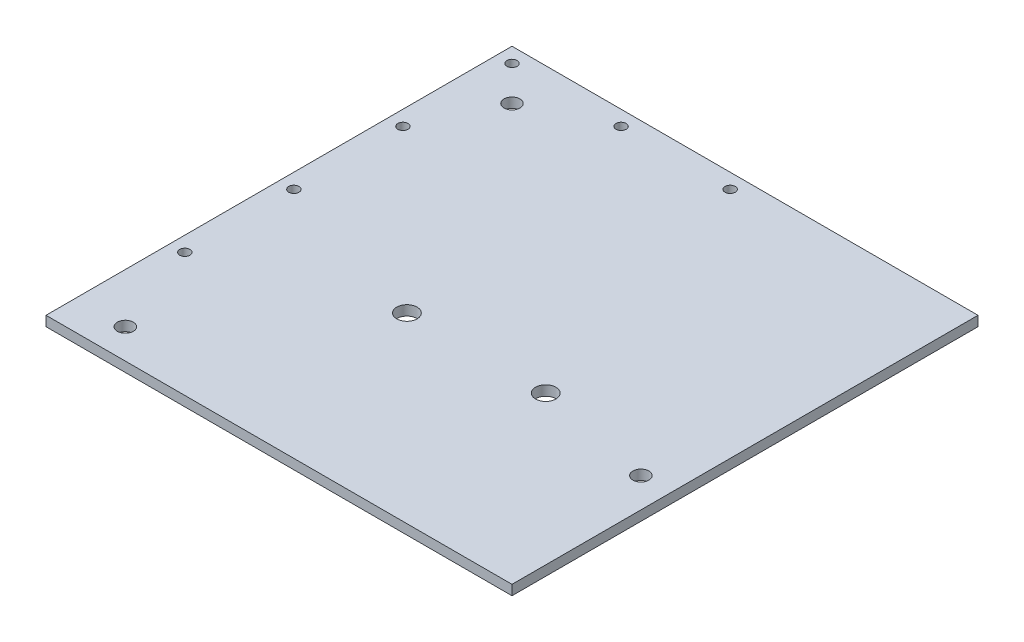
ISO-10303-21;
HEADER;
FILE_DESCRIPTION(('STEP AP214'),'2;1');
FILE_NAME('part.step','',(''),(''),'','','');
FILE_SCHEMA(('AUTOMOTIVE_DESIGN { 1 0 10303 214 1 1 1 1 }'));
ENDSEC;
DATA;
#1=APPLICATION_CONTEXT('core data for automotive mechanical design processes');
#2=APPLICATION_PROTOCOL_DEFINITION('international standard','automotive_design',2000,#1);
#3=PRODUCT_CONTEXT('',#1,'mechanical');
#4=PRODUCT('Part','Part','',(#3));
#5=PRODUCT_RELATED_PRODUCT_CATEGORY('part','',(#4));
#6=PRODUCT_DEFINITION_FORMATION('','',#4);
#7=PRODUCT_DEFINITION_CONTEXT('part definition',#1,'design');
#8=PRODUCT_DEFINITION('design','',#6,#7);
#9=PRODUCT_DEFINITION_SHAPE('','',#8);
#10=(LENGTH_UNIT() NAMED_UNIT(*) SI_UNIT(.MILLI.,.METRE.));
#11=(NAMED_UNIT(*) PLANE_ANGLE_UNIT() SI_UNIT($,.RADIAN.));
#12=(NAMED_UNIT(*) SI_UNIT($,.STERADIAN.) SOLID_ANGLE_UNIT());
#13=UNCERTAINTY_MEASURE_WITH_UNIT(LENGTH_MEASURE(1.E-05),#10,'distance_accuracy_value','');
#14=(GEOMETRIC_REPRESENTATION_CONTEXT(3) GLOBAL_UNCERTAINTY_ASSIGNED_CONTEXT((#13)) GLOBAL_UNIT_ASSIGNED_CONTEXT((#10,
#11,#12)) REPRESENTATION_CONTEXT('',''));
#15=CARTESIAN_POINT('',(0.,0.,0.));
#16=DIRECTION('',(0.,0.,1.));
#17=DIRECTION('',(1.,0.,0.));
#18=AXIS2_PLACEMENT_3D('',#15,#16,#17);
#19=CARTESIAN_POINT('',(-79.375,1.5875,-79.375));
#20=DIRECTION('',(0.,0.,1.));
#21=DIRECTION('',(1.,0.,0.));
#22=AXIS2_PLACEMENT_3D('',#19,#20,#21);
#23=PLANE('',#22);
#24=DIRECTION('',(-1.,0.,0.));
#25=VECTOR('',#24,1.);
#26=CARTESIAN_POINT('',(-79.375,-1.5875,-79.375));
#27=LINE('',#26,#25);
#28=CARTESIAN_POINT('',(69.85,-1.5875,-79.375));
#29=VERTEX_POINT('',#28);
#30=CARTESIAN_POINT('',(-79.375,-1.5875,-79.375));
#31=VERTEX_POINT('',#30);
#32=EDGE_CURVE('E88',#29,#31,#27,.T.);
#33=ORIENTED_EDGE('',*,*,#32,.T.);
#34=DIRECTION('',(0.,-1.,0.));
#35=VECTOR('',#34,1.);
#36=CARTESIAN_POINT('',(-79.375,1.5875,-79.375));
#37=LINE('',#36,#35);
#38=CARTESIAN_POINT('',(-79.375,1.5875,-79.375));
#39=VERTEX_POINT('',#38);
#40=EDGE_CURVE('E41',#39,#31,#37,.T.);
#41=ORIENTED_EDGE('',*,*,#40,.F.);
#42=DIRECTION('',(-1.,0.,0.));
#43=VECTOR('',#42,1.);
#44=CARTESIAN_POINT('',(-79.375,1.5875,-79.375));
#45=LINE('',#44,#43);
#46=CARTESIAN_POINT('',(69.85,1.5875,-79.375));
#47=VERTEX_POINT('',#46);
#48=EDGE_CURVE('E78',#47,#39,#45,.T.);
#49=ORIENTED_EDGE('',*,*,#48,.F.);
#50=DIRECTION('',(0.,-1.,0.));
#51=VECTOR('',#50,1.);
#52=CARTESIAN_POINT('',(69.85,1.5875,-79.375));
#53=LINE('',#52,#51);
#54=EDGE_CURVE('E11',#47,#29,#53,.T.);
#55=ORIENTED_EDGE('',*,*,#54,.T.);
#56=EDGE_LOOP('',(#33,#41,#49,#55));
#57=FACE_BOUND('',#56,.T.);
#58=ADVANCED_FACE('F33',(#57),#23,.F.);
#59=CARTESIAN_POINT('',(-79.375,1.5875,69.85));
#60=DIRECTION('',(1.,0.,0.));
#61=DIRECTION('',(0.,0.,-1.));
#62=AXIS2_PLACEMENT_3D('',#59,#60,#61);
#63=PLANE('',#62);
#64=DIRECTION('',(0.,0.,1.));
#65=VECTOR('',#64,1.);
#66=CARTESIAN_POINT('',(-79.375,-1.5875,69.85));
#67=LINE('',#66,#65);
#68=CARTESIAN_POINT('',(-79.375,-1.5875,69.85));
#69=VERTEX_POINT('',#68);
#70=EDGE_CURVE('E98',#31,#69,#67,.T.);
#71=ORIENTED_EDGE('',*,*,#70,.T.);
#72=DIRECTION('',(0.,-1.,0.));
#73=VECTOR('',#72,1.);
#74=CARTESIAN_POINT('',(-79.375,1.5875,69.85));
#75=LINE('',#74,#73);
#76=CARTESIAN_POINT('',(-79.375,1.5875,69.85));
#77=VERTEX_POINT('',#76);
#78=EDGE_CURVE('E90',#77,#69,#75,.T.);
#79=ORIENTED_EDGE('',*,*,#78,.F.);
#80=DIRECTION('',(0.,0.,1.));
#81=VECTOR('',#80,1.);
#82=CARTESIAN_POINT('',(-79.375,1.5875,69.85));
#83=LINE('',#82,#81);
#84=EDGE_CURVE('E81',#39,#77,#83,.T.);
#85=ORIENTED_EDGE('',*,*,#84,.F.);
#86=ORIENTED_EDGE('',*,*,#40,.T.);
#87=EDGE_LOOP('',(#71,#79,#85,#86));
#88=FACE_BOUND('',#87,.T.);
#89=ADVANCED_FACE('F91',(#88),#63,.F.);
#90=CARTESIAN_POINT('',(-69.85,1.5875,69.85));
#91=DIRECTION('',(0.,0.,-1.));
#92=DIRECTION('',(-1.,0.,0.));
#93=AXIS2_PLACEMENT_3D('',#90,#91,#92);
#94=PLANE('',#93);
#95=DIRECTION('',(1.,0.,0.));
#96=VECTOR('',#95,1.);
#97=CARTESIAN_POINT('',(-69.85,-1.5875,69.85));
#98=LINE('',#97,#96);
#99=CARTESIAN_POINT('',(69.85,-1.5875,69.85));
#100=VERTEX_POINT('',#99);
#101=EDGE_CURVE('E66',#69,#100,#98,.T.);
#102=ORIENTED_EDGE('',*,*,#101,.T.);
#103=DIRECTION('',(0.,-1.,0.));
#104=VECTOR('',#103,1.);
#105=CARTESIAN_POINT('',(69.85,1.5875,69.85));
#106=LINE('',#105,#104);
#107=CARTESIAN_POINT('',(69.85,1.5875,69.85));
#108=VERTEX_POINT('',#107);
#109=EDGE_CURVE('E93',#108,#100,#106,.T.);
#110=ORIENTED_EDGE('',*,*,#109,.F.);
#111=DIRECTION('',(1.,0.,0.));
#112=VECTOR('',#111,1.);
#113=CARTESIAN_POINT('',(-69.85,1.5875,69.85));
#114=LINE('',#113,#112);
#115=EDGE_CURVE('E49',#77,#108,#114,.T.);
#116=ORIENTED_EDGE('',*,*,#115,.F.);
#117=ORIENTED_EDGE('',*,*,#78,.T.);
#118=EDGE_LOOP('',(#102,#110,#116,#117));
#119=FACE_BOUND('',#118,.T.);
#120=ADVANCED_FACE('F105',(#119),#94,.F.);
#121=CARTESIAN_POINT('',(69.85,1.5875,69.85));
#122=DIRECTION('',(-1.,0.,0.));
#123=DIRECTION('',(0.,0.,1.));
#124=AXIS2_PLACEMENT_3D('',#121,#122,#123);
#125=PLANE('',#124);
#126=DIRECTION('',(0.,0.,-1.));
#127=VECTOR('',#126,1.);
#128=CARTESIAN_POINT('',(69.85,-1.5875,69.85));
#129=LINE('',#128,#127);
#130=EDGE_CURVE('E102',#100,#29,#129,.T.);
#131=ORIENTED_EDGE('',*,*,#130,.T.);
#132=ORIENTED_EDGE('',*,*,#54,.F.);
#133=DIRECTION('',(0.,0.,-1.));
#134=VECTOR('',#133,1.);
#135=CARTESIAN_POINT('',(69.85,1.5875,-79.375));
#136=LINE('',#135,#134);
#137=EDGE_CURVE('E83',#108,#47,#136,.T.);
#138=ORIENTED_EDGE('',*,*,#137,.F.);
#139=ORIENTED_EDGE('',*,*,#109,.T.);
#140=EDGE_LOOP('',(#131,#132,#138,#139));
#141=FACE_BOUND('',#140,.T.);
#142=ADVANCED_FACE('F107',(#141),#125,.F.);
#143=CARTESIAN_POINT('',(0.,1.5875,0.));
#144=DIRECTION('',(0.,1.,0.));
#145=DIRECTION('',(0.,0.,1.));
#146=AXIS2_PLACEMENT_3D('',#143,#144,#145);
#147=PLANE('',#146);
#148=CARTESIAN_POINT('',(-22.225,1.5875,11.43));
#149=DIRECTION('',(0.,1.,0.));
#150=DIRECTION('',(0.,0.,1.));
#151=AXIS2_PLACEMENT_3D('',#148,#149,#150);
#152=CIRCLE('',#151,3.26389999999999);
#153=CARTESIAN_POINT('',(-22.225,1.5875,14.6939));
#154=VERTEX_POINT('',#153);
#155=EDGE_CURVE('E260',#154,#154,#152,.T.);
#156=ORIENTED_EDGE('',*,*,#155,.F.);
#157=EDGE_LOOP('',(#156));
#158=FACE_BOUND('',#157,.T.);
#159=CARTESIAN_POINT('',(22.225,1.5875,11.43));
#160=DIRECTION('',(0.,1.,0.));
#161=DIRECTION('',(0.,0.,1.));
#162=AXIS2_PLACEMENT_3D('',#159,#160,#161);
#163=CIRCLE('',#162,3.26389999999999);
#164=CARTESIAN_POINT('',(22.225,1.5875,14.6939));
#165=VERTEX_POINT('',#164);
#166=EDGE_CURVE('E262',#165,#165,#163,.T.);
#167=ORIENTED_EDGE('',*,*,#166,.F.);
#168=EDGE_LOOP('',(#167));
#169=FACE_BOUND('',#168,.T.);
#170=CARTESIAN_POINT('',(-63.5,1.5875,60.325));
#171=DIRECTION('',(0.,1.,0.));
#172=DIRECTION('',(0.,0.,1.));
#173=AXIS2_PLACEMENT_3D('',#170,#171,#172);
#174=CIRCLE('',#173,2.55269999999999);
#175=CARTESIAN_POINT('',(-63.5,1.5875,62.8777));
#176=VERTEX_POINT('',#175);
#177=EDGE_CURVE('E270',#176,#176,#174,.T.);
#178=ORIENTED_EDGE('',*,*,#177,.F.);
#179=EDGE_LOOP('',(#178));
#180=FACE_BOUND('',#179,.T.);
#181=CARTESIAN_POINT('',(-63.5,1.5875,-63.5));
#182=DIRECTION('',(0.,1.,0.));
#183=DIRECTION('',(0.,0.,1.));
#184=AXIS2_PLACEMENT_3D('',#181,#182,#183);
#185=CIRCLE('',#184,2.55269999999999);
#186=CARTESIAN_POINT('',(-63.5,1.5875,-60.9473));
#187=VERTEX_POINT('',#186);
#188=EDGE_CURVE('E276',#187,#187,#185,.T.);
#189=ORIENTED_EDGE('',*,*,#188,.F.);
#190=EDGE_LOOP('',(#189));
#191=FACE_BOUND('',#190,.T.);
#192=CARTESIAN_POINT('',(60.325,1.5875,19.05));
#193=DIRECTION('',(0.,1.,0.));
#194=DIRECTION('',(0.,0.,1.));
#195=AXIS2_PLACEMENT_3D('',#192,#193,#194);
#196=CIRCLE('',#195,2.55269999999999);
#197=CARTESIAN_POINT('',(60.325,1.5875,21.6027));
#198=VERTEX_POINT('',#197);
#199=EDGE_CURVE('E282',#198,#198,#196,.T.);
#200=ORIENTED_EDGE('',*,*,#199,.F.);
#201=EDGE_LOOP('',(#200));
#202=FACE_BOUND('',#201,.T.);
#203=CARTESIAN_POINT('',(-74.6125,1.5875,-4.7625));
#204=DIRECTION('',(0.,1.,0.));
#205=DIRECTION('',(0.,0.,1.));
#206=AXIS2_PLACEMENT_3D('',#203,#204,#205);
#207=CIRCLE('',#206,1.63194999999999);
#208=CARTESIAN_POINT('',(-74.6125,1.5875,-3.13055000000001));
#209=VERTEX_POINT('',#208);
#210=EDGE_CURVE('E288',#209,#209,#207,.T.);
#211=ORIENTED_EDGE('',*,*,#210,.F.);
#212=EDGE_LOOP('',(#211));
#213=FACE_BOUND('',#212,.T.);
#214=CARTESIAN_POINT('',(-74.6125,1.5875,-39.6875));
#215=DIRECTION('',(0.,1.,0.));
#216=DIRECTION('',(0.,0.,1.));
#217=AXIS2_PLACEMENT_3D('',#214,#215,#216);
#218=CIRCLE('',#217,1.63194999999999);
#219=CARTESIAN_POINT('',(-74.6125,1.5875,-38.05555));
#220=VERTEX_POINT('',#219);
#221=EDGE_CURVE('E294',#220,#220,#218,.T.);
#222=ORIENTED_EDGE('',*,*,#221,.F.);
#223=EDGE_LOOP('',(#222));
#224=FACE_BOUND('',#223,.T.);
#225=CARTESIAN_POINT('',(-74.6125,1.5875,-74.6125));
#226=DIRECTION('',(0.,1.,0.));
#227=DIRECTION('',(0.,0.,1.));
#228=AXIS2_PLACEMENT_3D('',#225,#226,#227);
#229=CIRCLE('',#228,1.63194999999999);
#230=CARTESIAN_POINT('',(-74.6125,1.5875,-72.98055));
#231=VERTEX_POINT('',#230);
#232=EDGE_CURVE('E300',#231,#231,#229,.T.);
#233=ORIENTED_EDGE('',*,*,#232,.F.);
#234=EDGE_LOOP('',(#233));
#235=FACE_BOUND('',#234,.T.);
#236=CARTESIAN_POINT('',(-39.6875,1.5875,-74.6125));
#237=DIRECTION('',(0.,1.,0.));
#238=DIRECTION('',(0.,0.,1.));
#239=AXIS2_PLACEMENT_3D('',#236,#237,#238);
#240=CIRCLE('',#239,1.63195);
#241=CARTESIAN_POINT('',(-39.6875,1.5875,-72.98055));
#242=VERTEX_POINT('',#241);
#243=EDGE_CURVE('E306',#242,#242,#240,.T.);
#244=ORIENTED_EDGE('',*,*,#243,.F.);
#245=EDGE_LOOP('',(#244));
#246=FACE_BOUND('',#245,.T.);
#247=CARTESIAN_POINT('',(-4.76249999999999,1.5875,-74.6125));
#248=DIRECTION('',(0.,1.,0.));
#249=DIRECTION('',(0.,0.,1.));
#250=AXIS2_PLACEMENT_3D('',#247,#248,#249);
#251=CIRCLE('',#250,1.63195);
#252=CARTESIAN_POINT('',(-4.76249999999999,1.5875,-72.98055));
#253=VERTEX_POINT('',#252);
#254=EDGE_CURVE('E312',#253,#253,#251,.T.);
#255=ORIENTED_EDGE('',*,*,#254,.F.);
#256=EDGE_LOOP('',(#255));
#257=FACE_BOUND('',#256,.T.);
#258=CARTESIAN_POINT('',(-74.6125,1.5875,30.1625));
#259=DIRECTION('',(0.,1.,0.));
#260=DIRECTION('',(0.,0.,1.));
#261=AXIS2_PLACEMENT_3D('',#258,#259,#260);
#262=CIRCLE('',#261,1.63194999999999);
#263=CARTESIAN_POINT('',(-74.6125,1.5875,31.79445));
#264=VERTEX_POINT('',#263);
#265=EDGE_CURVE('E318',#264,#264,#262,.T.);
#266=ORIENTED_EDGE('',*,*,#265,.F.);
#267=EDGE_LOOP('',(#266));
#268=FACE_BOUND('',#267,.T.);
#269=ORIENTED_EDGE('',*,*,#137,.T.);
#270=ORIENTED_EDGE('',*,*,#48,.T.);
#271=ORIENTED_EDGE('',*,*,#84,.T.);
#272=ORIENTED_EDGE('',*,*,#115,.T.);
#273=EDGE_LOOP('',(#269,#270,#271,#272));
#274=FACE_BOUND('',#273,.T.);
#275=ADVANCED_FACE('F79',(#158,#169,#180,#191,#202,#213,#224,#235,#246,#257,#268,#274),#147,.T.);
#276=CARTESIAN_POINT('',(0.,-1.5875,0.));
#277=DIRECTION('',(0.,1.,0.));
#278=DIRECTION('',(0.,0.,1.));
#279=AXIS2_PLACEMENT_3D('',#276,#277,#278);
#280=PLANE('',#279);
#281=CARTESIAN_POINT('',(-22.225,-1.5875,11.43));
#282=DIRECTION('',(0.,1.,0.));
#283=DIRECTION('',(0.,0.,1.));
#284=AXIS2_PLACEMENT_3D('',#281,#282,#283);
#285=CIRCLE('',#284,3.2639);
#286=CARTESIAN_POINT('',(-22.225,-1.5875,14.6939));
#287=VERTEX_POINT('',#286);
#288=EDGE_CURVE('E257',#287,#287,#285,.T.);
#289=ORIENTED_EDGE('',*,*,#288,.T.);
#290=EDGE_LOOP('',(#289));
#291=FACE_BOUND('',#290,.T.);
#292=CARTESIAN_POINT('',(22.225,-1.5875,11.43));
#293=DIRECTION('',(0.,1.,0.));
#294=DIRECTION('',(0.,0.,1.));
#295=AXIS2_PLACEMENT_3D('',#292,#293,#294);
#296=CIRCLE('',#295,3.2639);
#297=CARTESIAN_POINT('',(22.225,-1.5875,14.6939));
#298=VERTEX_POINT('',#297);
#299=EDGE_CURVE('E267',#298,#298,#296,.T.);
#300=ORIENTED_EDGE('',*,*,#299,.T.);
#301=EDGE_LOOP('',(#300));
#302=FACE_BOUND('',#301,.T.);
#303=CARTESIAN_POINT('',(-63.5,-1.5875,60.325));
#304=DIRECTION('',(0.,1.,0.));
#305=DIRECTION('',(0.,0.,1.));
#306=AXIS2_PLACEMENT_3D('',#303,#304,#305);
#307=CIRCLE('',#306,2.55269999999999);
#308=CARTESIAN_POINT('',(-63.5,-1.5875,62.8777));
#309=VERTEX_POINT('',#308);
#310=EDGE_CURVE('E273',#309,#309,#307,.T.);
#311=ORIENTED_EDGE('',*,*,#310,.T.);
#312=EDGE_LOOP('',(#311));
#313=FACE_BOUND('',#312,.T.);
#314=CARTESIAN_POINT('',(-63.5,-1.5875,-63.5));
#315=DIRECTION('',(0.,1.,0.));
#316=DIRECTION('',(0.,0.,1.));
#317=AXIS2_PLACEMENT_3D('',#314,#315,#316);
#318=CIRCLE('',#317,2.55269999999999);
#319=CARTESIAN_POINT('',(-63.5,-1.5875,-60.9473));
#320=VERTEX_POINT('',#319);
#321=EDGE_CURVE('E279',#320,#320,#318,.T.);
#322=ORIENTED_EDGE('',*,*,#321,.T.);
#323=EDGE_LOOP('',(#322));
#324=FACE_BOUND('',#323,.T.);
#325=CARTESIAN_POINT('',(60.325,-1.5875,19.05));
#326=DIRECTION('',(0.,1.,0.));
#327=DIRECTION('',(0.,0.,1.));
#328=AXIS2_PLACEMENT_3D('',#325,#326,#327);
#329=CIRCLE('',#328,2.5527);
#330=CARTESIAN_POINT('',(60.325,-1.5875,21.6027));
#331=VERTEX_POINT('',#330);
#332=EDGE_CURVE('E285',#331,#331,#329,.T.);
#333=ORIENTED_EDGE('',*,*,#332,.T.);
#334=EDGE_LOOP('',(#333));
#335=FACE_BOUND('',#334,.T.);
#336=CARTESIAN_POINT('',(-74.6125,-1.5875,-4.7625));
#337=DIRECTION('',(0.,1.,0.));
#338=DIRECTION('',(0.,0.,1.));
#339=AXIS2_PLACEMENT_3D('',#336,#337,#338);
#340=CIRCLE('',#339,1.63194999999999);
#341=CARTESIAN_POINT('',(-74.6125,-1.5875,-3.13055000000001));
#342=VERTEX_POINT('',#341);
#343=EDGE_CURVE('E291',#342,#342,#340,.T.);
#344=ORIENTED_EDGE('',*,*,#343,.T.);
#345=EDGE_LOOP('',(#344));
#346=FACE_BOUND('',#345,.T.);
#347=CARTESIAN_POINT('',(-74.6125,-1.5875,-39.6875));
#348=DIRECTION('',(0.,1.,0.));
#349=DIRECTION('',(0.,0.,1.));
#350=AXIS2_PLACEMENT_3D('',#347,#348,#349);
#351=CIRCLE('',#350,1.63194999999999);
#352=CARTESIAN_POINT('',(-74.6125,-1.5875,-38.05555));
#353=VERTEX_POINT('',#352);
#354=EDGE_CURVE('E297',#353,#353,#351,.T.);
#355=ORIENTED_EDGE('',*,*,#354,.T.);
#356=EDGE_LOOP('',(#355));
#357=FACE_BOUND('',#356,.T.);
#358=CARTESIAN_POINT('',(-74.6125,-1.5875,-74.6125));
#359=DIRECTION('',(0.,1.,0.));
#360=DIRECTION('',(0.,0.,1.));
#361=AXIS2_PLACEMENT_3D('',#358,#359,#360);
#362=CIRCLE('',#361,1.63194999999999);
#363=CARTESIAN_POINT('',(-74.6125,-1.5875,-72.98055));
#364=VERTEX_POINT('',#363);
#365=EDGE_CURVE('E303',#364,#364,#362,.T.);
#366=ORIENTED_EDGE('',*,*,#365,.T.);
#367=EDGE_LOOP('',(#366));
#368=FACE_BOUND('',#367,.T.);
#369=CARTESIAN_POINT('',(-39.6875,-1.5875,-74.6125));
#370=DIRECTION('',(0.,1.,0.));
#371=DIRECTION('',(0.,0.,1.));
#372=AXIS2_PLACEMENT_3D('',#369,#370,#371);
#373=CIRCLE('',#372,1.63194999999999);
#374=CARTESIAN_POINT('',(-39.6875,-1.5875,-72.98055));
#375=VERTEX_POINT('',#374);
#376=EDGE_CURVE('E309',#375,#375,#373,.T.);
#377=ORIENTED_EDGE('',*,*,#376,.T.);
#378=EDGE_LOOP('',(#377));
#379=FACE_BOUND('',#378,.T.);
#380=CARTESIAN_POINT('',(-4.76249999999999,-1.5875,-74.6125));
#381=DIRECTION('',(0.,1.,0.));
#382=DIRECTION('',(0.,0.,1.));
#383=AXIS2_PLACEMENT_3D('',#380,#381,#382);
#384=CIRCLE('',#383,1.63195);
#385=CARTESIAN_POINT('',(-4.76249999999999,-1.5875,-72.98055));
#386=VERTEX_POINT('',#385);
#387=EDGE_CURVE('E315',#386,#386,#384,.T.);
#388=ORIENTED_EDGE('',*,*,#387,.T.);
#389=EDGE_LOOP('',(#388));
#390=FACE_BOUND('',#389,.T.);
#391=CARTESIAN_POINT('',(-74.6125,-1.5875,30.1625));
#392=DIRECTION('',(0.,1.,0.));
#393=DIRECTION('',(0.,0.,1.));
#394=AXIS2_PLACEMENT_3D('',#391,#392,#393);
#395=CIRCLE('',#394,1.63194999999999);
#396=CARTESIAN_POINT('',(-74.6125,-1.5875,31.79445));
#397=VERTEX_POINT('',#396);
#398=EDGE_CURVE('E99',#397,#397,#395,.T.);
#399=ORIENTED_EDGE('',*,*,#398,.T.);
#400=EDGE_LOOP('',(#399));
#401=FACE_BOUND('',#400,.T.);
#402=ORIENTED_EDGE('',*,*,#32,.F.);
#403=ORIENTED_EDGE('',*,*,#130,.F.);
#404=ORIENTED_EDGE('',*,*,#101,.F.);
#405=ORIENTED_EDGE('',*,*,#70,.F.);
#406=EDGE_LOOP('',(#402,#403,#404,#405));
#407=FACE_BOUND('',#406,.T.);
#408=ADVANCED_FACE('F108',(#291,#302,#313,#324,#335,#346,#357,#368,#379,#390,#401,#407),#280,.F.);
#409=CARTESIAN_POINT('',(-74.6125,1.5875,30.1625));
#410=DIRECTION('',(0.,1.,0.));
#411=DIRECTION('',(0.,0.,1.));
#412=AXIS2_PLACEMENT_3D('',#409,#410,#411);
#413=CYLINDRICAL_SURFACE('',#412,1.63194999999999);
#414=ORIENTED_EDGE('',*,*,#398,.F.);
#415=EDGE_LOOP('',(#414));
#416=FACE_BOUND('',#415,.T.);
#417=ORIENTED_EDGE('',*,*,#265,.T.);
#418=EDGE_LOOP('',(#417));
#419=FACE_BOUND('',#418,.T.);
#420=ADVANCED_FACE('F110',(#416,#419),#413,.F.);
#421=CARTESIAN_POINT('',(-4.76249999999999,1.5875,-74.6125));
#422=DIRECTION('',(0.,1.,0.));
#423=DIRECTION('',(0.,0.,1.));
#424=AXIS2_PLACEMENT_3D('',#421,#422,#423);
#425=CYLINDRICAL_SURFACE('',#424,1.63195);
#426=ORIENTED_EDGE('',*,*,#387,.F.);
#427=EDGE_LOOP('',(#426));
#428=FACE_BOUND('',#427,.T.);
#429=ORIENTED_EDGE('',*,*,#254,.T.);
#430=EDGE_LOOP('',(#429));
#431=FACE_BOUND('',#430,.T.);
#432=ADVANCED_FACE('F118',(#428,#431),#425,.F.);
#433=CARTESIAN_POINT('',(-39.6875,1.5875,-74.6125));
#434=DIRECTION('',(0.,1.,0.));
#435=DIRECTION('',(0.,0.,1.));
#436=AXIS2_PLACEMENT_3D('',#433,#434,#435);
#437=CYLINDRICAL_SURFACE('',#436,1.63195);
#438=ORIENTED_EDGE('',*,*,#376,.F.);
#439=EDGE_LOOP('',(#438));
#440=FACE_BOUND('',#439,.T.);
#441=ORIENTED_EDGE('',*,*,#243,.T.);
#442=EDGE_LOOP('',(#441));
#443=FACE_BOUND('',#442,.T.);
#444=ADVANCED_FACE('F160',(#440,#443),#437,.F.);
#445=CARTESIAN_POINT('',(-74.6125,1.5875,-74.6125));
#446=DIRECTION('',(0.,1.,0.));
#447=DIRECTION('',(0.,0.,1.));
#448=AXIS2_PLACEMENT_3D('',#445,#446,#447);
#449=CYLINDRICAL_SURFACE('',#448,1.63194999999999);
#450=ORIENTED_EDGE('',*,*,#365,.F.);
#451=EDGE_LOOP('',(#450));
#452=FACE_BOUND('',#451,.T.);
#453=ORIENTED_EDGE('',*,*,#232,.T.);
#454=EDGE_LOOP('',(#453));
#455=FACE_BOUND('',#454,.T.);
#456=ADVANCED_FACE('F168',(#452,#455),#449,.F.);
#457=CARTESIAN_POINT('',(-74.6125,1.5875,-39.6875));
#458=DIRECTION('',(0.,1.,0.));
#459=DIRECTION('',(0.,0.,1.));
#460=AXIS2_PLACEMENT_3D('',#457,#458,#459);
#461=CYLINDRICAL_SURFACE('',#460,1.63194999999999);
#462=ORIENTED_EDGE('',*,*,#354,.F.);
#463=EDGE_LOOP('',(#462));
#464=FACE_BOUND('',#463,.T.);
#465=ORIENTED_EDGE('',*,*,#221,.T.);
#466=EDGE_LOOP('',(#465));
#467=FACE_BOUND('',#466,.T.);
#468=ADVANCED_FACE('F176',(#464,#467),#461,.F.);
#469=CARTESIAN_POINT('',(-74.6125,1.5875,-4.7625));
#470=DIRECTION('',(0.,1.,0.));
#471=DIRECTION('',(0.,0.,1.));
#472=AXIS2_PLACEMENT_3D('',#469,#470,#471);
#473=CYLINDRICAL_SURFACE('',#472,1.63194999999999);
#474=ORIENTED_EDGE('',*,*,#343,.F.);
#475=EDGE_LOOP('',(#474));
#476=FACE_BOUND('',#475,.T.);
#477=ORIENTED_EDGE('',*,*,#210,.T.);
#478=EDGE_LOOP('',(#477));
#479=FACE_BOUND('',#478,.T.);
#480=ADVANCED_FACE('F184',(#476,#479),#473,.F.);
#481=CARTESIAN_POINT('',(60.325,1.5875,19.05));
#482=DIRECTION('',(0.,1.,0.));
#483=DIRECTION('',(0.,0.,1.));
#484=AXIS2_PLACEMENT_3D('',#481,#482,#483);
#485=CYLINDRICAL_SURFACE('',#484,2.5527);
#486=ORIENTED_EDGE('',*,*,#332,.F.);
#487=EDGE_LOOP('',(#486));
#488=FACE_BOUND('',#487,.T.);
#489=ORIENTED_EDGE('',*,*,#199,.T.);
#490=EDGE_LOOP('',(#489));
#491=FACE_BOUND('',#490,.T.);
#492=ADVANCED_FACE('F192',(#488,#491),#485,.F.);
#493=CARTESIAN_POINT('',(-63.5,1.5875,-63.5));
#494=DIRECTION('',(0.,1.,0.));
#495=DIRECTION('',(0.,0.,1.));
#496=AXIS2_PLACEMENT_3D('',#493,#494,#495);
#497=CYLINDRICAL_SURFACE('',#496,2.55269999999999);
#498=ORIENTED_EDGE('',*,*,#321,.F.);
#499=EDGE_LOOP('',(#498));
#500=FACE_BOUND('',#499,.T.);
#501=ORIENTED_EDGE('',*,*,#188,.T.);
#502=EDGE_LOOP('',(#501));
#503=FACE_BOUND('',#502,.T.);
#504=ADVANCED_FACE('F200',(#500,#503),#497,.F.);
#505=CARTESIAN_POINT('',(-63.5,1.5875,60.325));
#506=DIRECTION('',(0.,1.,0.));
#507=DIRECTION('',(0.,0.,1.));
#508=AXIS2_PLACEMENT_3D('',#505,#506,#507);
#509=CYLINDRICAL_SURFACE('',#508,2.55269999999999);
#510=ORIENTED_EDGE('',*,*,#310,.F.);
#511=EDGE_LOOP('',(#510));
#512=FACE_BOUND('',#511,.T.);
#513=ORIENTED_EDGE('',*,*,#177,.T.);
#514=EDGE_LOOP('',(#513));
#515=FACE_BOUND('',#514,.T.);
#516=ADVANCED_FACE('F208',(#512,#515),#509,.F.);
#517=CARTESIAN_POINT('',(22.225,1.5875,11.43));
#518=DIRECTION('',(0.,1.,0.));
#519=DIRECTION('',(0.,0.,1.));
#520=AXIS2_PLACEMENT_3D('',#517,#518,#519);
#521=CYLINDRICAL_SURFACE('',#520,3.26389999999999);
#522=ORIENTED_EDGE('',*,*,#299,.F.);
#523=EDGE_LOOP('',(#522));
#524=FACE_BOUND('',#523,.T.);
#525=ORIENTED_EDGE('',*,*,#166,.T.);
#526=EDGE_LOOP('',(#525));
#527=FACE_BOUND('',#526,.T.);
#528=ADVANCED_FACE('F215',(#524,#527),#521,.F.);
#529=CARTESIAN_POINT('',(-22.225,1.5875,11.43));
#530=DIRECTION('',(0.,1.,0.));
#531=DIRECTION('',(0.,0.,1.));
#532=AXIS2_PLACEMENT_3D('',#529,#530,#531);
#533=CYLINDRICAL_SURFACE('',#532,3.26389999999999);
#534=ORIENTED_EDGE('',*,*,#288,.F.);
#535=EDGE_LOOP('',(#534));
#536=FACE_BOUND('',#535,.T.);
#537=ORIENTED_EDGE('',*,*,#155,.T.);
#538=EDGE_LOOP('',(#537));
#539=FACE_BOUND('',#538,.T.);
#540=ADVANCED_FACE('F222',(#536,#539),#533,.F.);
#541=CLOSED_SHELL('',(#58,#89,#120,#142,#275,#408,#420,#432,#444,#456,#468,#480,#492,#504,#516,
#528,#540));
#542=MANIFOLD_SOLID_BREP('B2',#541);
#543=ADVANCED_BREP_SHAPE_REPRESENTATION('',(#18,#542),#14);
#544=SHAPE_DEFINITION_REPRESENTATION(#9,#543);
ENDSEC;
END-ISO-10303-21;
